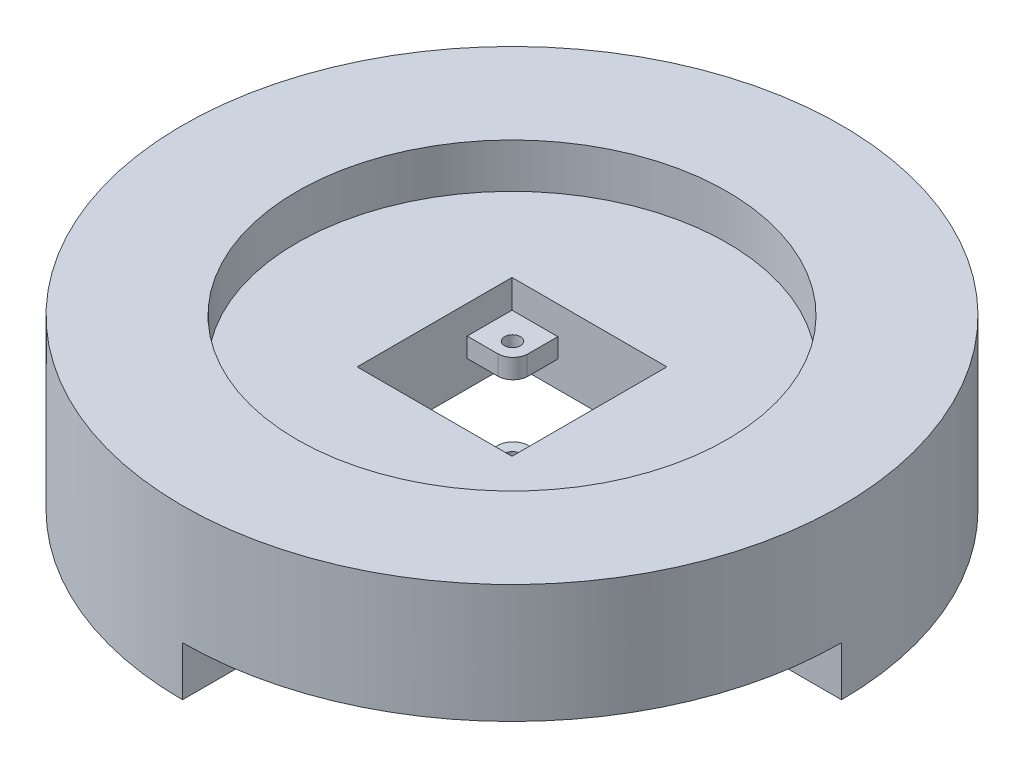
ISO-10303-21;
HEADER;
FILE_DESCRIPTION(('STEP AP214'),'2;1');
FILE_NAME('part.step','',(''),(''),'','','');
FILE_SCHEMA(('AUTOMOTIVE_DESIGN { 1 0 10303 214 1 1 1 1 }'));
ENDSEC;
DATA;
#1=APPLICATION_CONTEXT('core data for automotive mechanical design processes');
#2=APPLICATION_PROTOCOL_DEFINITION('international standard','automotive_design',2000,#1);
#3=PRODUCT_CONTEXT('',#1,'mechanical');
#4=PRODUCT('Part','Part','',(#3));
#5=PRODUCT_RELATED_PRODUCT_CATEGORY('part','',(#4));
#6=PRODUCT_DEFINITION_FORMATION('','',#4);
#7=PRODUCT_DEFINITION_CONTEXT('part definition',#1,'design');
#8=PRODUCT_DEFINITION('design','',#6,#7);
#9=PRODUCT_DEFINITION_SHAPE('','',#8);
#10=(LENGTH_UNIT() NAMED_UNIT(*) SI_UNIT(.MILLI.,.METRE.));
#11=(NAMED_UNIT(*) PLANE_ANGLE_UNIT() SI_UNIT($,.RADIAN.));
#12=(NAMED_UNIT(*) SI_UNIT($,.STERADIAN.) SOLID_ANGLE_UNIT());
#13=UNCERTAINTY_MEASURE_WITH_UNIT(LENGTH_MEASURE(1.E-05),#10,'distance_accuracy_value','');
#14=(GEOMETRIC_REPRESENTATION_CONTEXT(3) GLOBAL_UNCERTAINTY_ASSIGNED_CONTEXT((#13)) GLOBAL_UNIT_ASSIGNED_CONTEXT((#10,
#11,#12)) REPRESENTATION_CONTEXT('',''));
#15=CARTESIAN_POINT('',(0.,0.,0.));
#16=DIRECTION('',(0.,0.,1.));
#17=DIRECTION('',(1.,0.,0.));
#18=AXIS2_PLACEMENT_3D('',#15,#16,#17);
#19=CARTESIAN_POINT('',(0.,7.,0.));
#20=DIRECTION('',(0.,-1.,0.));
#21=DIRECTION('',(0.,0.,-1.));
#22=AXIS2_PLACEMENT_3D('',#19,#20,#21);
#23=PLANE('',#22);
#24=DIRECTION('',(0.,0.,1.));
#25=VECTOR('',#24,1.);
#26=CARTESIAN_POINT('',(-11.75,7.,-11.75));
#27=LINE('',#26,#25);
#28=CARTESIAN_POINT('',(-11.75,7.,-11.75));
#29=VERTEX_POINT('',#28);
#30=CARTESIAN_POINT('',(-11.75,7.,11.75));
#31=VERTEX_POINT('',#30);
#32=EDGE_CURVE('E258',#29,#31,#27,.T.);
#33=ORIENTED_EDGE('',*,*,#32,.T.);
#34=DIRECTION('',(1.,0.,0.));
#35=VECTOR('',#34,1.);
#36=CARTESIAN_POINT('',(11.75,7.,11.75));
#37=LINE('',#36,#35);
#38=CARTESIAN_POINT('',(11.75,7.,11.75));
#39=VERTEX_POINT('',#38);
#40=EDGE_CURVE('E11',#31,#39,#37,.T.);
#41=ORIENTED_EDGE('',*,*,#40,.T.);
#42=DIRECTION('',(0.,0.,-1.));
#43=VECTOR('',#42,1.);
#44=CARTESIAN_POINT('',(11.75,7.,-11.75));
#45=LINE('',#44,#43);
#46=CARTESIAN_POINT('',(11.75,7.,-11.75));
#47=VERTEX_POINT('',#46);
#48=EDGE_CURVE('E253',#39,#47,#45,.T.);
#49=ORIENTED_EDGE('',*,*,#48,.T.);
#50=DIRECTION('',(-1.,0.,0.));
#51=VECTOR('',#50,1.);
#52=CARTESIAN_POINT('',(11.75,7.,-11.75));
#53=LINE('',#52,#51);
#54=EDGE_CURVE('E256',#47,#29,#53,.T.);
#55=ORIENTED_EDGE('',*,*,#54,.T.);
#56=EDGE_LOOP('',(#33,#41,#49,#55));
#57=FACE_BOUND('',#56,.T.);
#58=CARTESIAN_POINT('',(0.,7.,0.));
#59=DIRECTION('',(0.,-1.,0.));
#60=DIRECTION('',(0.,0.,-1.));
#61=AXIS2_PLACEMENT_3D('',#58,#59,#60);
#62=CIRCLE('',#61,50.);
#63=CARTESIAN_POINT('',(-50.,7.,0.));
#64=VERTEX_POINT('',#63);
#65=CARTESIAN_POINT('',(0.,7.,-50.));
#66=VERTEX_POINT('',#65);
#67=EDGE_CURVE('E251',#64,#66,#62,.T.);
#68=ORIENTED_EDGE('',*,*,#67,.T.);
#69=DIRECTION('',(0.,0.,-1.));
#70=VECTOR('',#69,1.);
#71=CARTESIAN_POINT('',(0.,7.,-40.));
#72=LINE('',#71,#70);
#73=CARTESIAN_POINT('',(0.,7.,-40.));
#74=VERTEX_POINT('',#73);
#75=EDGE_CURVE('E195',#74,#66,#72,.T.);
#76=ORIENTED_EDGE('',*,*,#75,.F.);
#77=CARTESIAN_POINT('',(0.,7.,0.));
#78=DIRECTION('',(0.,1.,0.));
#79=DIRECTION('',(0.,0.,-1.));
#80=AXIS2_PLACEMENT_3D('',#77,#78,#79);
#81=CIRCLE('',#80,40.);
#82=CARTESIAN_POINT('',(40.,7.,0.));
#83=VERTEX_POINT('',#82);
#84=EDGE_CURVE('E202',#83,#74,#81,.T.);
#85=ORIENTED_EDGE('',*,*,#84,.F.);
#86=DIRECTION('',(-1.,0.,0.));
#87=VECTOR('',#86,1.);
#88=CARTESIAN_POINT('',(40.,7.,0.));
#89=LINE('',#88,#87);
#90=CARTESIAN_POINT('',(50.,7.,0.));
#91=VERTEX_POINT('',#90);
#92=EDGE_CURVE('E188',#91,#83,#89,.T.);
#93=ORIENTED_EDGE('',*,*,#92,.F.);
#94=CARTESIAN_POINT('',(0.,7.,50.));
#95=VERTEX_POINT('',#94);
#96=EDGE_CURVE('E254',#91,#95,#62,.T.);
#97=ORIENTED_EDGE('',*,*,#96,.T.);
#98=DIRECTION('',(0.,0.,1.));
#99=VECTOR('',#98,1.);
#100=CARTESIAN_POINT('',(0.,7.,50.));
#101=LINE('',#100,#99);
#102=CARTESIAN_POINT('',(0.,7.,40.));
#103=VERTEX_POINT('',#102);
#104=EDGE_CURVE('E64',#103,#95,#101,.T.);
#105=ORIENTED_EDGE('',*,*,#104,.F.);
#106=CARTESIAN_POINT('',(0.,7.,0.));
#107=DIRECTION('',(0.,1.,0.));
#108=DIRECTION('',(0.,0.,-1.));
#109=AXIS2_PLACEMENT_3D('',#106,#107,#108);
#110=CIRCLE('',#109,40.);
#111=CARTESIAN_POINT('',(-40.,7.,0.));
#112=VERTEX_POINT('',#111);
#113=EDGE_CURVE('E211',#112,#103,#110,.T.);
#114=ORIENTED_EDGE('',*,*,#113,.F.);
#115=DIRECTION('',(1.,0.,0.));
#116=VECTOR('',#115,1.);
#117=CARTESIAN_POINT('',(-50.,7.,0.));
#118=LINE('',#117,#116);
#119=EDGE_CURVE('E208',#64,#112,#118,.T.);
#120=ORIENTED_EDGE('',*,*,#119,.F.);
#121=EDGE_LOOP('',(#68,#76,#85,#93,#97,#105,#114,#120));
#122=FACE_BOUND('',#121,.T.);
#123=ADVANCED_FACE('F39',(#57,#122),#23,.T.);
#124=CARTESIAN_POINT('',(0.,25.,0.));
#125=DIRECTION('',(0.,-1.,0.));
#126=DIRECTION('',(0.,0.,-1.));
#127=AXIS2_PLACEMENT_3D('',#124,#125,#126);
#128=CYLINDRICAL_SURFACE('',#127,50.);
#129=CARTESIAN_POINT('',(0.,25.,0.));
#130=DIRECTION('',(0.,1.,0.));
#131=DIRECTION('',(0.,0.,1.));
#132=AXIS2_PLACEMENT_3D('',#129,#130,#131);
#133=CIRCLE('',#132,50.);
#134=CARTESIAN_POINT('',(0.,25.,50.));
#135=VERTEX_POINT('',#134);
#136=EDGE_CURVE('E352',#135,#135,#133,.T.);
#137=ORIENTED_EDGE('',*,*,#136,.F.);
#138=EDGE_LOOP('',(#137));
#139=FACE_BOUND('',#138,.T.);
#140=ORIENTED_EDGE('',*,*,#67,.F.);
#141=DIRECTION('',(0.,1.,0.));
#142=VECTOR('',#141,1.);
#143=CARTESIAN_POINT('',(-50.,-0.5,0.));
#144=LINE('',#143,#142);
#145=CARTESIAN_POINT('',(-50.,-0.5,0.));
#146=VERTEX_POINT('',#145);
#147=EDGE_CURVE('E241',#146,#64,#144,.T.);
#148=ORIENTED_EDGE('',*,*,#147,.F.);
#149=CARTESIAN_POINT('',(0.,-0.5,0.));
#150=DIRECTION('',(0.,-1.,0.));
#151=DIRECTION('',(0.,0.,-1.));
#152=AXIS2_PLACEMENT_3D('',#149,#150,#151);
#153=CIRCLE('',#152,50.);
#154=CARTESIAN_POINT('',(0.,-0.5,50.));
#155=VERTEX_POINT('',#154);
#156=EDGE_CURVE('E221',#155,#146,#153,.T.);
#157=ORIENTED_EDGE('',*,*,#156,.F.);
#158=DIRECTION('',(0.,1.,0.));
#159=VECTOR('',#158,1.);
#160=CARTESIAN_POINT('',(0.,-0.5,50.));
#161=LINE('',#160,#159);
#162=EDGE_CURVE('E229',#155,#95,#161,.T.);
#163=ORIENTED_EDGE('',*,*,#162,.T.);
#164=ORIENTED_EDGE('',*,*,#96,.F.);
#165=DIRECTION('',(0.,1.,0.));
#166=VECTOR('',#165,1.);
#167=CARTESIAN_POINT('',(50.,-0.5,0.));
#168=LINE('',#167,#166);
#169=CARTESIAN_POINT('',(50.,-0.5,0.));
#170=VERTEX_POINT('',#169);
#171=EDGE_CURVE('E56',#170,#91,#168,.T.);
#172=ORIENTED_EDGE('',*,*,#171,.F.);
#173=CARTESIAN_POINT('',(0.,-0.5,0.));
#174=DIRECTION('',(0.,-1.,0.));
#175=DIRECTION('',(0.,0.,-1.));
#176=AXIS2_PLACEMENT_3D('',#173,#174,#175);
#177=CIRCLE('',#176,50.);
#178=CARTESIAN_POINT('',(0.,-0.5,-50.));
#179=VERTEX_POINT('',#178);
#180=EDGE_CURVE('E216',#179,#170,#177,.T.);
#181=ORIENTED_EDGE('',*,*,#180,.F.);
#182=DIRECTION('',(0.,1.,0.));
#183=VECTOR('',#182,1.);
#184=CARTESIAN_POINT('',(0.,-0.5,-50.));
#185=LINE('',#184,#183);
#186=EDGE_CURVE('E622',#179,#66,#185,.T.);
#187=ORIENTED_EDGE('',*,*,#186,.T.);
#188=EDGE_LOOP('',(#140,#148,#157,#163,#164,#172,#181,#187));
#189=FACE_BOUND('',#188,.T.);
#190=ADVANCED_FACE('F41',(#139,#189),#128,.T.);
#191=CARTESIAN_POINT('',(-11.75,13.95,-11.75));
#192=DIRECTION('',(-1.,0.,0.));
#193=DIRECTION('',(0.,0.,1.));
#194=AXIS2_PLACEMENT_3D('',#191,#192,#193);
#195=PLANE('',#194);
#196=ORIENTED_EDGE('',*,*,#32,.F.);
#197=DIRECTION('',(0.,-1.,0.));
#198=VECTOR('',#197,1.);
#199=CARTESIAN_POINT('',(-11.75,11.,-11.75));
#200=LINE('',#199,#198);
#201=CARTESIAN_POINT('',(-11.75,11.,-11.75));
#202=VERTEX_POINT('',#201);
#203=EDGE_CURVE('E268',#202,#29,#200,.T.);
#204=ORIENTED_EDGE('',*,*,#203,.F.);
#205=DIRECTION('',(0.,0.,-1.));
#206=VECTOR('',#205,1.);
#207=CARTESIAN_POINT('',(-11.75,11.,11.75));
#208=LINE('',#207,#206);
#209=CARTESIAN_POINT('',(-11.75,11.,-4.95));
#210=VERTEX_POINT('',#209);
#211=EDGE_CURVE('E260',#210,#202,#208,.T.);
#212=ORIENTED_EDGE('',*,*,#211,.F.);
#213=DIRECTION('',(0.,1.,0.));
#214=VECTOR('',#213,1.);
#215=CARTESIAN_POINT('',(-11.75,-33.2340187157677,-4.95));
#216=LINE('',#215,#214);
#217=CARTESIAN_POINT('',(-11.75,13.95,-4.95));
#218=VERTEX_POINT('',#217);
#219=EDGE_CURVE('E303',#210,#218,#216,.T.);
#220=ORIENTED_EDGE('',*,*,#219,.T.);
#221=DIRECTION('',(0.,0.,1.));
#222=VECTOR('',#221,1.);
#223=CARTESIAN_POINT('',(-11.75,13.95,-11.75));
#224=LINE('',#223,#222);
#225=CARTESIAN_POINT('',(-11.75,13.95,-11.75));
#226=VERTEX_POINT('',#225);
#227=EDGE_CURVE('E319',#226,#218,#224,.T.);
#228=ORIENTED_EDGE('',*,*,#227,.F.);
#229=DIRECTION('',(0.,1.,0.));
#230=VECTOR('',#229,1.);
#231=CARTESIAN_POINT('',(-11.75,13.95,-11.75));
#232=LINE('',#231,#230);
#233=CARTESIAN_POINT('',(-11.75,18.25,-11.75));
#234=VERTEX_POINT('',#233);
#235=EDGE_CURVE('E341',#226,#234,#232,.T.);
#236=ORIENTED_EDGE('',*,*,#235,.T.);
#237=DIRECTION('',(0.,0.,1.));
#238=VECTOR('',#237,1.);
#239=CARTESIAN_POINT('',(-11.75,18.25,-11.75));
#240=LINE('',#239,#238);
#241=CARTESIAN_POINT('',(-11.75,18.25,11.75));
#242=VERTEX_POINT('',#241);
#243=EDGE_CURVE('E305',#234,#242,#240,.T.);
#244=ORIENTED_EDGE('',*,*,#243,.T.);
#245=DIRECTION('',(0.,1.,0.));
#246=VECTOR('',#245,1.);
#247=CARTESIAN_POINT('',(-11.75,13.95,11.75));
#248=LINE('',#247,#246);
#249=EDGE_CURVE('E330',#31,#242,#248,.T.);
#250=ORIENTED_EDGE('',*,*,#249,.F.);
#251=EDGE_LOOP('',(#196,#204,#212,#220,#228,#236,#244,#250));
#252=FACE_BOUND('',#251,.T.);
#253=ADVANCED_FACE('F397',(#252),#195,.F.);
#254=CARTESIAN_POINT('',(11.75,13.95,-11.75));
#255=DIRECTION('',(0.,0.,-1.));
#256=DIRECTION('',(-1.,0.,0.));
#257=AXIS2_PLACEMENT_3D('',#254,#255,#256);
#258=PLANE('',#257);
#259=ORIENTED_EDGE('',*,*,#54,.F.);
#260=DIRECTION('',(0.,1.,0.));
#261=VECTOR('',#260,1.);
#262=CARTESIAN_POINT('',(11.75,13.95,-11.75));
#263=LINE('',#262,#261);
#264=CARTESIAN_POINT('',(11.75,18.25,-11.75));
#265=VERTEX_POINT('',#264);
#266=EDGE_CURVE('E344',#47,#265,#263,.T.);
#267=ORIENTED_EDGE('',*,*,#266,.T.);
#268=DIRECTION('',(-1.,0.,0.));
#269=VECTOR('',#268,1.);
#270=CARTESIAN_POINT('',(11.75,18.25,-11.75));
#271=LINE('',#270,#269);
#272=EDGE_CURVE('E323',#265,#234,#271,.T.);
#273=ORIENTED_EDGE('',*,*,#272,.T.);
#274=ORIENTED_EDGE('',*,*,#235,.F.);
#275=DIRECTION('',(-1.,0.,0.));
#276=VECTOR('',#275,1.);
#277=CARTESIAN_POINT('',(11.75,13.95,-11.75));
#278=LINE('',#277,#276);
#279=CARTESIAN_POINT('',(-4.8,13.95,-11.75));
#280=VERTEX_POINT('',#279);
#281=EDGE_CURVE('E328',#280,#226,#278,.T.);
#282=ORIENTED_EDGE('',*,*,#281,.F.);
#283=DIRECTION('',(0.,1.,0.));
#284=VECTOR('',#283,1.);
#285=CARTESIAN_POINT('',(-4.8,-33.2340187157677,-11.75));
#286=LINE('',#285,#284);
#287=CARTESIAN_POINT('',(-4.8,11.,-11.75));
#288=VERTEX_POINT('',#287);
#289=EDGE_CURVE('E310',#288,#280,#286,.T.);
#290=ORIENTED_EDGE('',*,*,#289,.F.);
#291=DIRECTION('',(1.,0.,0.));
#292=VECTOR('',#291,1.);
#293=CARTESIAN_POINT('',(-11.75,11.,-11.75));
#294=LINE('',#293,#292);
#295=EDGE_CURVE('E262',#202,#288,#294,.T.);
#296=ORIENTED_EDGE('',*,*,#295,.F.);
#297=ORIENTED_EDGE('',*,*,#203,.T.);
#298=EDGE_LOOP('',(#259,#267,#273,#274,#282,#290,#296,#297));
#299=FACE_BOUND('',#298,.T.);
#300=ADVANCED_FACE('F435',(#299),#258,.F.);
#301=CARTESIAN_POINT('',(11.75,13.95,-11.75));
#302=DIRECTION('',(1.,0.,0.));
#303=DIRECTION('',(0.,0.,-1.));
#304=AXIS2_PLACEMENT_3D('',#301,#302,#303);
#305=PLANE('',#304);
#306=ORIENTED_EDGE('',*,*,#48,.F.);
#307=DIRECTION('',(0.,-1.,0.));
#308=VECTOR('',#307,1.);
#309=CARTESIAN_POINT('',(11.75,11.,11.75));
#310=LINE('',#309,#308);
#311=CARTESIAN_POINT('',(11.75,11.,11.75));
#312=VERTEX_POINT('',#311);
#313=EDGE_CURVE('E269',#312,#39,#310,.T.);
#314=ORIENTED_EDGE('',*,*,#313,.F.);
#315=DIRECTION('',(0.,0.,1.));
#316=VECTOR('',#315,1.);
#317=CARTESIAN_POINT('',(11.75,11.,11.75));
#318=LINE('',#317,#316);
#319=CARTESIAN_POINT('',(11.75,11.,4.8));
#320=VERTEX_POINT('',#319);
#321=EDGE_CURVE('E264',#320,#312,#318,.T.);
#322=ORIENTED_EDGE('',*,*,#321,.F.);
#323=DIRECTION('',(0.,1.,0.));
#324=VECTOR('',#323,1.);
#325=CARTESIAN_POINT('',(11.75,-33.2340187157677,4.8));
#326=LINE('',#325,#324);
#327=CARTESIAN_POINT('',(11.75,13.95,4.8));
#328=VERTEX_POINT('',#327);
#329=EDGE_CURVE('E312',#320,#328,#326,.T.);
#330=ORIENTED_EDGE('',*,*,#329,.T.);
#331=DIRECTION('',(0.,0.,-1.));
#332=VECTOR('',#331,1.);
#333=CARTESIAN_POINT('',(11.75,13.95,-11.75));
#334=LINE('',#333,#332);
#335=CARTESIAN_POINT('',(11.75,13.95,11.75));
#336=VERTEX_POINT('',#335);
#337=EDGE_CURVE('E325',#336,#328,#334,.T.);
#338=ORIENTED_EDGE('',*,*,#337,.F.);
#339=DIRECTION('',(0.,1.,0.));
#340=VECTOR('',#339,1.);
#341=CARTESIAN_POINT('',(11.75,13.95,11.75));
#342=LINE('',#341,#340);
#343=CARTESIAN_POINT('',(11.75,18.25,11.75));
#344=VERTEX_POINT('',#343);
#345=EDGE_CURVE('E346',#336,#344,#342,.T.);
#346=ORIENTED_EDGE('',*,*,#345,.T.);
#347=DIRECTION('',(0.,0.,-1.));
#348=VECTOR('',#347,1.);
#349=CARTESIAN_POINT('',(11.75,18.25,-11.75));
#350=LINE('',#349,#348);
#351=EDGE_CURVE('E336',#344,#265,#350,.T.);
#352=ORIENTED_EDGE('',*,*,#351,.T.);
#353=ORIENTED_EDGE('',*,*,#266,.F.);
#354=EDGE_LOOP('',(#306,#314,#322,#330,#338,#346,#352,#353));
#355=FACE_BOUND('',#354,.T.);
#356=ADVANCED_FACE('F438',(#355),#305,.F.);
#357=CARTESIAN_POINT('',(11.75,13.95,11.75));
#358=DIRECTION('',(0.,0.,1.));
#359=DIRECTION('',(1.,0.,0.));
#360=AXIS2_PLACEMENT_3D('',#357,#358,#359);
#361=PLANE('',#360);
#362=ORIENTED_EDGE('',*,*,#40,.F.);
#363=ORIENTED_EDGE('',*,*,#249,.T.);
#364=DIRECTION('',(1.,0.,0.));
#365=VECTOR('',#364,1.);
#366=CARTESIAN_POINT('',(11.75,18.25,11.75));
#367=LINE('',#366,#365);
#368=EDGE_CURVE('E333',#242,#344,#367,.T.);
#369=ORIENTED_EDGE('',*,*,#368,.T.);
#370=ORIENTED_EDGE('',*,*,#345,.F.);
#371=DIRECTION('',(1.,0.,0.));
#372=VECTOR('',#371,1.);
#373=CARTESIAN_POINT('',(11.75,13.95,11.75));
#374=LINE('',#373,#372);
#375=CARTESIAN_POINT('',(4.95,13.95,11.75));
#376=VERTEX_POINT('',#375);
#377=EDGE_CURVE('E322',#376,#336,#374,.T.);
#378=ORIENTED_EDGE('',*,*,#377,.F.);
#379=DIRECTION('',(0.,1.,0.));
#380=VECTOR('',#379,1.);
#381=CARTESIAN_POINT('',(4.95,-33.2340187157677,11.75));
#382=LINE('',#381,#380);
#383=CARTESIAN_POINT('',(4.95,11.,11.75));
#384=VERTEX_POINT('',#383);
#385=EDGE_CURVE('E302',#384,#376,#382,.T.);
#386=ORIENTED_EDGE('',*,*,#385,.F.);
#387=DIRECTION('',(-1.,0.,0.));
#388=VECTOR('',#387,1.);
#389=CARTESIAN_POINT('',(-11.75,11.,11.75));
#390=LINE('',#389,#388);
#391=EDGE_CURVE('E266',#312,#384,#390,.T.);
#392=ORIENTED_EDGE('',*,*,#391,.F.);
#393=ORIENTED_EDGE('',*,*,#313,.T.);
#394=EDGE_LOOP('',(#362,#363,#369,#370,#378,#386,#392,#393));
#395=FACE_BOUND('',#394,.T.);
#396=ADVANCED_FACE('F409',(#395),#361,.F.);
#397=CARTESIAN_POINT('',(-11.75,-33.2340187157677,-4.95));
#398=DIRECTION('',(0.,0.,-1.));
#399=DIRECTION('',(-1.,0.,0.));
#400=AXIS2_PLACEMENT_3D('',#397,#398,#399);
#401=PLANE('',#400);
#402=DIRECTION('',(-1.,0.,0.));
#403=VECTOR('',#402,1.);
#404=CARTESIAN_POINT('',(-11.75,11.,-4.95));
#405=LINE('',#404,#403);
#406=CARTESIAN_POINT('',(-7.1,11.,-4.95));
#407=VERTEX_POINT('',#406);
#408=EDGE_CURVE('E282',#407,#210,#405,.T.);
#409=ORIENTED_EDGE('',*,*,#408,.F.);
#410=DIRECTION('',(0.,1.,0.));
#411=VECTOR('',#410,1.);
#412=CARTESIAN_POINT('',(-7.1,-33.2340187157677,-4.95));
#413=LINE('',#412,#411);
#414=CARTESIAN_POINT('',(-7.1,13.95,-4.95));
#415=VERTEX_POINT('',#414);
#416=EDGE_CURVE('E306',#407,#415,#413,.T.);
#417=ORIENTED_EDGE('',*,*,#416,.T.);
#418=DIRECTION('',(-1.,0.,0.));
#419=VECTOR('',#418,1.);
#420=CARTESIAN_POINT('',(-11.75,13.95,-4.95));
#421=LINE('',#420,#419);
#422=EDGE_CURVE('E299',#415,#218,#421,.T.);
#423=ORIENTED_EDGE('',*,*,#422,.T.);
#424=ORIENTED_EDGE('',*,*,#219,.F.);
#425=EDGE_LOOP('',(#409,#417,#423,#424));
#426=FACE_BOUND('',#425,.T.);
#427=ADVANCED_FACE('F405',(#426),#401,.F.);
#428=CARTESIAN_POINT('',(-7.1,-33.2340187157677,-7.25523255813953));
#429=DIRECTION('',(0.,1.,0.));
#430=DIRECTION('',(0.,0.,1.));
#431=AXIS2_PLACEMENT_3D('',#428,#429,#430);
#432=CYLINDRICAL_SURFACE('',#431,2.30523255813953);
#433=CARTESIAN_POINT('',(-7.1,11.,-7.25523255813953));
#434=DIRECTION('',(0.,-1.,0.));
#435=DIRECTION('',(0.,0.,-1.));
#436=AXIS2_PLACEMENT_3D('',#433,#434,#435);
#437=CIRCLE('',#436,2.30523255813953);
#438=CARTESIAN_POINT('',(-4.8,11.,-7.1));
#439=VERTEX_POINT('',#438);
#440=EDGE_CURVE('E280',#439,#407,#437,.T.);
#441=ORIENTED_EDGE('',*,*,#440,.F.);
#442=DIRECTION('',(0.,1.,0.));
#443=VECTOR('',#442,1.);
#444=CARTESIAN_POINT('',(-4.8,-33.2340187157677,-7.1));
#445=LINE('',#444,#443);
#446=CARTESIAN_POINT('',(-4.8,13.95,-7.1));
#447=VERTEX_POINT('',#446);
#448=EDGE_CURVE('E308',#439,#447,#445,.T.);
#449=ORIENTED_EDGE('',*,*,#448,.T.);
#450=CARTESIAN_POINT('',(-7.1,13.95,-7.25523255813953));
#451=DIRECTION('',(0.,-1.,0.));
#452=DIRECTION('',(0.,0.,-1.));
#453=AXIS2_PLACEMENT_3D('',#450,#451,#452);
#454=CIRCLE('',#453,2.30523255813953);
#455=EDGE_CURVE('E296',#447,#415,#454,.T.);
#456=ORIENTED_EDGE('',*,*,#455,.T.);
#457=ORIENTED_EDGE('',*,*,#416,.F.);
#458=EDGE_LOOP('',(#441,#449,#456,#457));
#459=FACE_BOUND('',#458,.T.);
#460=ADVANCED_FACE('F408',(#459),#432,.T.);
#461=CARTESIAN_POINT('',(-4.8,-33.2340187157677,-7.1));
#462=DIRECTION('',(-1.,0.,0.));
#463=DIRECTION('',(0.,0.,1.));
#464=AXIS2_PLACEMENT_3D('',#461,#462,#463);
#465=PLANE('',#464);
#466=DIRECTION('',(0.,0.,1.));
#467=VECTOR('',#466,1.);
#468=CARTESIAN_POINT('',(-4.8,11.,-7.1));
#469=LINE('',#468,#467);
#470=EDGE_CURVE('E278',#288,#439,#469,.T.);
#471=ORIENTED_EDGE('',*,*,#470,.F.);
#472=ORIENTED_EDGE('',*,*,#289,.T.);
#473=DIRECTION('',(0.,0.,1.));
#474=VECTOR('',#473,1.);
#475=CARTESIAN_POINT('',(-4.8,13.95,-7.1));
#476=LINE('',#475,#474);
#477=EDGE_CURVE('E293',#280,#447,#476,.T.);
#478=ORIENTED_EDGE('',*,*,#477,.T.);
#479=ORIENTED_EDGE('',*,*,#448,.F.);
#480=EDGE_LOOP('',(#471,#472,#478,#479));
#481=FACE_BOUND('',#480,.T.);
#482=ADVANCED_FACE('F413',(#481),#465,.F.);
#483=CARTESIAN_POINT('',(7.09999999999999,-33.2340187157677,4.8));
#484=DIRECTION('',(0.,0.,1.));
#485=DIRECTION('',(1.,0.,0.));
#486=AXIS2_PLACEMENT_3D('',#483,#484,#485);
#487=PLANE('',#486);
#488=DIRECTION('',(1.,0.,0.));
#489=VECTOR('',#488,1.);
#490=CARTESIAN_POINT('',(7.09999999999999,11.,4.8));
#491=LINE('',#490,#489);
#492=CARTESIAN_POINT('',(7.09999999999999,11.,4.8));
#493=VERTEX_POINT('',#492);
#494=EDGE_CURVE('E276',#493,#320,#491,.T.);
#495=ORIENTED_EDGE('',*,*,#494,.F.);
#496=DIRECTION('',(0.,1.,0.));
#497=VECTOR('',#496,1.);
#498=CARTESIAN_POINT('',(7.09999999999999,-33.2340187157677,4.8));
#499=LINE('',#498,#497);
#500=CARTESIAN_POINT('',(7.09999999999999,13.95,4.8));
#501=VERTEX_POINT('',#500);
#502=EDGE_CURVE('E314',#493,#501,#499,.T.);
#503=ORIENTED_EDGE('',*,*,#502,.T.);
#504=DIRECTION('',(1.,0.,0.));
#505=VECTOR('',#504,1.);
#506=CARTESIAN_POINT('',(7.09999999999999,13.95,4.8));
#507=LINE('',#506,#505);
#508=EDGE_CURVE('E290',#501,#328,#507,.T.);
#509=ORIENTED_EDGE('',*,*,#508,.T.);
#510=ORIENTED_EDGE('',*,*,#329,.F.);
#511=EDGE_LOOP('',(#495,#503,#509,#510));
#512=FACE_BOUND('',#511,.T.);
#513=ADVANCED_FACE('F417',(#512),#487,.F.);
#514=CARTESIAN_POINT('',(7.25523255813953,-33.2340187157677,7.1));
#515=DIRECTION('',(0.,1.,0.));
#516=DIRECTION('',(0.,0.,1.));
#517=AXIS2_PLACEMENT_3D('',#514,#515,#516);
#518=CYLINDRICAL_SURFACE('',#517,2.30523255813954);
#519=CARTESIAN_POINT('',(7.25523255813953,11.,7.1));
#520=DIRECTION('',(0.,-1.,0.));
#521=DIRECTION('',(0.,0.,-1.));
#522=AXIS2_PLACEMENT_3D('',#519,#520,#521);
#523=CIRCLE('',#522,2.30523255813954);
#524=CARTESIAN_POINT('',(4.94999999999999,11.,7.1));
#525=VERTEX_POINT('',#524);
#526=EDGE_CURVE('E272',#525,#493,#523,.T.);
#527=ORIENTED_EDGE('',*,*,#526,.F.);
#528=DIRECTION('',(0.,1.,0.));
#529=VECTOR('',#528,1.);
#530=CARTESIAN_POINT('',(4.94999999999999,-33.2340187157677,7.1));
#531=LINE('',#530,#529);
#532=CARTESIAN_POINT('',(4.94999999999999,13.95,7.1));
#533=VERTEX_POINT('',#532);
#534=EDGE_CURVE('E316',#525,#533,#531,.T.);
#535=ORIENTED_EDGE('',*,*,#534,.T.);
#536=CARTESIAN_POINT('',(7.25523255813953,13.95,7.1));
#537=DIRECTION('',(0.,-1.,0.));
#538=DIRECTION('',(0.,0.,1.));
#539=AXIS2_PLACEMENT_3D('',#536,#537,#538);
#540=CIRCLE('',#539,2.30523255813954);
#541=EDGE_CURVE('E287',#533,#501,#540,.T.);
#542=ORIENTED_EDGE('',*,*,#541,.T.);
#543=ORIENTED_EDGE('',*,*,#502,.F.);
#544=EDGE_LOOP('',(#527,#535,#542,#543));
#545=FACE_BOUND('',#544,.T.);
#546=ADVANCED_FACE('F421',(#545),#518,.T.);
#547=CARTESIAN_POINT('',(4.95,-33.2340187157677,11.75));
#548=DIRECTION('',(1.,0.,0.));
#549=DIRECTION('',(0.,0.,-1.));
#550=AXIS2_PLACEMENT_3D('',#547,#548,#549);
#551=PLANE('',#550);
#552=DIRECTION('',(0.,0.,-1.));
#553=VECTOR('',#552,1.);
#554=CARTESIAN_POINT('',(4.95,11.,11.75));
#555=LINE('',#554,#553);
#556=EDGE_CURVE('E48',#384,#525,#555,.T.);
#557=ORIENTED_EDGE('',*,*,#556,.F.);
#558=ORIENTED_EDGE('',*,*,#385,.T.);
#559=DIRECTION('',(0.,0.,-1.));
#560=VECTOR('',#559,1.);
#561=CARTESIAN_POINT('',(4.95,13.95,11.75));
#562=LINE('',#561,#560);
#563=EDGE_CURVE('E284',#376,#533,#562,.T.);
#564=ORIENTED_EDGE('',*,*,#563,.T.);
#565=ORIENTED_EDGE('',*,*,#534,.F.);
#566=EDGE_LOOP('',(#557,#558,#564,#565));
#567=FACE_BOUND('',#566,.T.);
#568=ADVANCED_FACE('F425',(#567),#551,.F.);
#569=CARTESIAN_POINT('',(0.,13.95,0.));
#570=DIRECTION('',(0.,-1.,0.));
#571=DIRECTION('',(0.,0.,-1.));
#572=AXIS2_PLACEMENT_3D('',#569,#570,#571);
#573=PLANE('',#572);
#574=CARTESIAN_POINT('',(7.71360389693213,13.95,7.63860389693208));
#575=DIRECTION('',(0.,1.,0.));
#576=DIRECTION('',(0.,0.,1.));
#577=AXIS2_PLACEMENT_3D('',#574,#575,#576);
#578=CIRCLE('',#577,1.2);
#579=CARTESIAN_POINT('',(7.71360389693213,13.95,8.83860389693208));
#580=VERTEX_POINT('',#579);
#581=EDGE_CURVE('E244',#580,#580,#578,.T.);
#582=ORIENTED_EDGE('',*,*,#581,.F.);
#583=EDGE_LOOP('',(#582));
#584=FACE_BOUND('',#583,.T.);
#585=ORIENTED_EDGE('',*,*,#563,.F.);
#586=ORIENTED_EDGE('',*,*,#377,.T.);
#587=ORIENTED_EDGE('',*,*,#337,.T.);
#588=ORIENTED_EDGE('',*,*,#508,.F.);
#589=ORIENTED_EDGE('',*,*,#541,.F.);
#590=EDGE_LOOP('',(#585,#586,#587,#588,#589));
#591=FACE_BOUND('',#590,.T.);
#592=ADVANCED_FACE('F429',(#584,#591),#573,.F.);
#593=CARTESIAN_POINT('',(-7.63860389693209,13.95,-7.71360389693213));
#594=DIRECTION('',(0.,1.,0.));
#595=DIRECTION('',(0.,0.,1.));
#596=AXIS2_PLACEMENT_3D('',#593,#594,#595);
#597=CIRCLE('',#596,1.2);
#598=CARTESIAN_POINT('',(-7.63860389693209,13.95,-6.51360389693213));
#599=VERTEX_POINT('',#598);
#600=EDGE_CURVE('E245',#599,#599,#597,.T.);
#601=ORIENTED_EDGE('',*,*,#600,.F.);
#602=EDGE_LOOP('',(#601));
#603=FACE_BOUND('',#602,.T.);
#604=ORIENTED_EDGE('',*,*,#477,.F.);
#605=ORIENTED_EDGE('',*,*,#281,.T.);
#606=ORIENTED_EDGE('',*,*,#227,.T.);
#607=ORIENTED_EDGE('',*,*,#422,.F.);
#608=ORIENTED_EDGE('',*,*,#455,.F.);
#609=EDGE_LOOP('',(#604,#605,#606,#607,#608));
#610=FACE_BOUND('',#609,.T.);
#611=ADVANCED_FACE('F433',(#603,#610),#573,.F.);
#612=CARTESIAN_POINT('',(0.,25.,0.));
#613=DIRECTION('',(0.,1.,0.));
#614=DIRECTION('',(0.,0.,1.));
#615=AXIS2_PLACEMENT_3D('',#612,#613,#614);
#616=PLANE('',#615);
#617=CARTESIAN_POINT('',(0.,25.,0.));
#618=DIRECTION('',(0.,1.,0.));
#619=DIRECTION('',(0.,0.,1.));
#620=AXIS2_PLACEMENT_3D('',#617,#618,#619);
#621=CIRCLE('',#620,32.625);
#622=CARTESIAN_POINT('',(0.,25.,32.625));
#623=VERTEX_POINT('',#622);
#624=EDGE_CURVE('E343',#623,#623,#621,.T.);
#625=ORIENTED_EDGE('',*,*,#624,.F.);
#626=EDGE_LOOP('',(#625));
#627=FACE_BOUND('',#626,.T.);
#628=ORIENTED_EDGE('',*,*,#136,.T.);
#629=EDGE_LOOP('',(#628));
#630=FACE_BOUND('',#629,.T.);
#631=ADVANCED_FACE('F455',(#627,#630),#616,.T.);
#632=CARTESIAN_POINT('',(0.,18.25,0.));
#633=DIRECTION('',(0.,1.,0.));
#634=DIRECTION('',(0.,0.,1.));
#635=AXIS2_PLACEMENT_3D('',#632,#633,#634);
#636=CYLINDRICAL_SURFACE('',#635,32.625);
#637=CARTESIAN_POINT('',(0.,18.25,0.));
#638=DIRECTION('',(0.,1.,0.));
#639=DIRECTION('',(0.,0.,1.));
#640=AXIS2_PLACEMENT_3D('',#637,#638,#639);
#641=CIRCLE('',#640,32.625);
#642=CARTESIAN_POINT('',(0.,18.25,32.625));
#643=VERTEX_POINT('',#642);
#644=EDGE_CURVE('E349',#643,#643,#641,.T.);
#645=ORIENTED_EDGE('',*,*,#644,.F.);
#646=EDGE_LOOP('',(#645));
#647=FACE_BOUND('',#646,.T.);
#648=ORIENTED_EDGE('',*,*,#624,.T.);
#649=EDGE_LOOP('',(#648));
#650=FACE_BOUND('',#649,.T.);
#651=ADVANCED_FACE('F452',(#647,#650),#636,.F.);
#652=CARTESIAN_POINT('',(0.,18.25,0.));
#653=DIRECTION('',(0.,1.,0.));
#654=DIRECTION('',(0.,0.,1.));
#655=AXIS2_PLACEMENT_3D('',#652,#653,#654);
#656=PLANE('',#655);
#657=ORIENTED_EDGE('',*,*,#243,.F.);
#658=ORIENTED_EDGE('',*,*,#272,.F.);
#659=ORIENTED_EDGE('',*,*,#351,.F.);
#660=ORIENTED_EDGE('',*,*,#368,.F.);
#661=EDGE_LOOP('',(#657,#658,#659,#660));
#662=FACE_BOUND('',#661,.T.);
#663=ORIENTED_EDGE('',*,*,#644,.T.);
#664=EDGE_LOOP('',(#663));
#665=FACE_BOUND('',#664,.T.);
#666=ADVANCED_FACE('F449',(#662,#665),#656,.T.);
#667=CARTESIAN_POINT('',(0.,11.,0.));
#668=DIRECTION('',(0.,-1.,0.));
#669=DIRECTION('',(0.,0.,-1.));
#670=AXIS2_PLACEMENT_3D('',#667,#668,#669);
#671=PLANE('',#670);
#672=CARTESIAN_POINT('',(7.71360389693213,11.,7.63860389693208));
#673=DIRECTION('',(0.,-1.,0.));
#674=DIRECTION('',(0.,0.,-1.));
#675=AXIS2_PLACEMENT_3D('',#672,#673,#674);
#676=CIRCLE('',#675,1.2);
#677=CARTESIAN_POINT('',(7.71360389693213,11.,6.43860389693208));
#678=VERTEX_POINT('',#677);
#679=EDGE_CURVE('E43',#678,#678,#676,.T.);
#680=ORIENTED_EDGE('',*,*,#679,.F.);
#681=EDGE_LOOP('',(#680));
#682=FACE_BOUND('',#681,.T.);
#683=ORIENTED_EDGE('',*,*,#494,.T.);
#684=ORIENTED_EDGE('',*,*,#321,.T.);
#685=ORIENTED_EDGE('',*,*,#391,.T.);
#686=ORIENTED_EDGE('',*,*,#556,.T.);
#687=ORIENTED_EDGE('',*,*,#526,.T.);
#688=EDGE_LOOP('',(#683,#684,#685,#686,#687));
#689=FACE_BOUND('',#688,.T.);
#690=ADVANCED_FACE('F403',(#682,#689),#671,.T.);
#691=CARTESIAN_POINT('',(-7.63860389693209,11.,-7.71360389693213));
#692=DIRECTION('',(0.,-1.,0.));
#693=DIRECTION('',(0.,0.,-1.));
#694=AXIS2_PLACEMENT_3D('',#691,#692,#693);
#695=CIRCLE('',#694,1.2);
#696=CARTESIAN_POINT('',(-7.63860389693209,11.,-8.91360389693213));
#697=VERTEX_POINT('',#696);
#698=EDGE_CURVE('E248',#697,#697,#695,.T.);
#699=ORIENTED_EDGE('',*,*,#698,.F.);
#700=EDGE_LOOP('',(#699));
#701=FACE_BOUND('',#700,.T.);
#702=ORIENTED_EDGE('',*,*,#408,.T.);
#703=ORIENTED_EDGE('',*,*,#211,.T.);
#704=ORIENTED_EDGE('',*,*,#295,.T.);
#705=ORIENTED_EDGE('',*,*,#470,.T.);
#706=ORIENTED_EDGE('',*,*,#440,.T.);
#707=EDGE_LOOP('',(#702,#703,#704,#705,#706));
#708=FACE_BOUND('',#707,.T.);
#709=ADVANCED_FACE('F400',(#701,#708),#671,.T.);
#710=CARTESIAN_POINT('',(-7.63860389693209,7.,-7.71360389693213));
#711=DIRECTION('',(0.,1.,0.));
#712=DIRECTION('',(0.,0.,1.));
#713=AXIS2_PLACEMENT_3D('',#710,#711,#712);
#714=CYLINDRICAL_SURFACE('',#713,1.2);
#715=ORIENTED_EDGE('',*,*,#698,.T.);
#716=EDGE_LOOP('',(#715));
#717=FACE_BOUND('',#716,.T.);
#718=ORIENTED_EDGE('',*,*,#600,.T.);
#719=EDGE_LOOP('',(#718));
#720=FACE_BOUND('',#719,.T.);
#721=ADVANCED_FACE('F389',(#717,#720),#714,.F.);
#722=CARTESIAN_POINT('',(7.71360389693213,7.,7.63860389693208));
#723=DIRECTION('',(0.,1.,0.));
#724=DIRECTION('',(0.,0.,1.));
#725=AXIS2_PLACEMENT_3D('',#722,#723,#724);
#726=CYLINDRICAL_SURFACE('',#725,1.2);
#727=ORIENTED_EDGE('',*,*,#679,.T.);
#728=EDGE_LOOP('',(#727));
#729=FACE_BOUND('',#728,.T.);
#730=ORIENTED_EDGE('',*,*,#581,.T.);
#731=EDGE_LOOP('',(#730));
#732=FACE_BOUND('',#731,.T.);
#733=ADVANCED_FACE('F381',(#729,#732),#726,.F.);
#734=CARTESIAN_POINT('',(-50.,-0.5,0.));
#735=DIRECTION('',(0.,0.,1.));
#736=DIRECTION('',(1.,0.,0.));
#737=AXIS2_PLACEMENT_3D('',#734,#735,#736);
#738=PLANE('',#737);
#739=ORIENTED_EDGE('',*,*,#119,.T.);
#740=DIRECTION('',(0.,1.,0.));
#741=VECTOR('',#740,1.);
#742=CARTESIAN_POINT('',(-40.,-0.5,0.));
#743=LINE('',#742,#741);
#744=CARTESIAN_POINT('',(-40.,-0.5,0.));
#745=VERTEX_POINT('',#744);
#746=EDGE_CURVE('E238',#745,#112,#743,.T.);
#747=ORIENTED_EDGE('',*,*,#746,.F.);
#748=DIRECTION('',(1.,0.,0.));
#749=VECTOR('',#748,1.);
#750=CARTESIAN_POINT('',(-50.,-0.5,0.));
#751=LINE('',#750,#749);
#752=EDGE_CURVE('E224',#146,#745,#751,.T.);
#753=ORIENTED_EDGE('',*,*,#752,.F.);
#754=ORIENTED_EDGE('',*,*,#147,.T.);
#755=EDGE_LOOP('',(#739,#747,#753,#754));
#756=FACE_BOUND('',#755,.T.);
#757=ADVANCED_FACE('F379',(#756),#738,.F.);
#758=CARTESIAN_POINT('',(0.,-0.5,0.));
#759=DIRECTION('',(0.,1.,0.));
#760=DIRECTION('',(0.,0.,1.));
#761=AXIS2_PLACEMENT_3D('',#758,#759,#760);
#762=CYLINDRICAL_SURFACE('',#761,40.);
#763=ORIENTED_EDGE('',*,*,#113,.T.);
#764=DIRECTION('',(0.,1.,0.));
#765=VECTOR('',#764,1.);
#766=CARTESIAN_POINT('',(0.,-0.5,40.));
#767=LINE('',#766,#765);
#768=CARTESIAN_POINT('',(0.,-0.5,40.));
#769=VERTEX_POINT('',#768);
#770=EDGE_CURVE('E235',#769,#103,#767,.T.);
#771=ORIENTED_EDGE('',*,*,#770,.F.);
#772=CARTESIAN_POINT('',(0.,-0.5,0.));
#773=DIRECTION('',(0.,1.,0.));
#774=DIRECTION('',(0.,0.,-1.));
#775=AXIS2_PLACEMENT_3D('',#772,#773,#774);
#776=CIRCLE('',#775,40.);
#777=EDGE_CURVE('E226',#745,#769,#776,.T.);
#778=ORIENTED_EDGE('',*,*,#777,.F.);
#779=ORIENTED_EDGE('',*,*,#746,.T.);
#780=EDGE_LOOP('',(#763,#771,#778,#779));
#781=FACE_BOUND('',#780,.T.);
#782=ADVANCED_FACE('F377',(#781),#762,.F.);
#783=CARTESIAN_POINT('',(0.,-0.5,50.));
#784=DIRECTION('',(-1.,0.,0.));
#785=DIRECTION('',(0.,0.,1.));
#786=AXIS2_PLACEMENT_3D('',#783,#784,#785);
#787=PLANE('',#786);
#788=ORIENTED_EDGE('',*,*,#104,.T.);
#789=ORIENTED_EDGE('',*,*,#162,.F.);
#790=DIRECTION('',(0.,0.,1.));
#791=VECTOR('',#790,1.);
#792=CARTESIAN_POINT('',(0.,-0.5,50.));
#793=LINE('',#792,#791);
#794=EDGE_CURVE('E228',#769,#155,#793,.T.);
#795=ORIENTED_EDGE('',*,*,#794,.F.);
#796=ORIENTED_EDGE('',*,*,#770,.T.);
#797=EDGE_LOOP('',(#788,#789,#795,#796));
#798=FACE_BOUND('',#797,.T.);
#799=ADVANCED_FACE('F366',(#798),#787,.F.);
#800=CARTESIAN_POINT('',(0.,-0.5,0.));
#801=DIRECTION('',(0.,-1.,0.));
#802=DIRECTION('',(0.,0.,-1.));
#803=AXIS2_PLACEMENT_3D('',#800,#801,#802);
#804=PLANE('',#803);
#805=ORIENTED_EDGE('',*,*,#156,.T.);
#806=ORIENTED_EDGE('',*,*,#752,.T.);
#807=ORIENTED_EDGE('',*,*,#777,.T.);
#808=ORIENTED_EDGE('',*,*,#794,.T.);
#809=EDGE_LOOP('',(#805,#806,#807,#808));
#810=FACE_BOUND('',#809,.T.);
#811=ADVANCED_FACE('F373',(#810),#804,.T.);
#812=CARTESIAN_POINT('',(0.,-0.5,0.));
#813=DIRECTION('',(0.,1.,0.));
#814=DIRECTION('',(0.,0.,1.));
#815=AXIS2_PLACEMENT_3D('',#812,#813,#814);
#816=CYLINDRICAL_SURFACE('',#815,40.);
#817=ORIENTED_EDGE('',*,*,#84,.T.);
#818=DIRECTION('',(0.,1.,0.));
#819=VECTOR('',#818,1.);
#820=CARTESIAN_POINT('',(0.,-0.5,-40.));
#821=LINE('',#820,#819);
#822=CARTESIAN_POINT('',(0.,-0.5,-40.));
#823=VERTEX_POINT('',#822);
#824=EDGE_CURVE('E621',#823,#74,#821,.T.);
#825=ORIENTED_EDGE('',*,*,#824,.F.);
#826=CARTESIAN_POINT('',(0.,-0.5,0.));
#827=DIRECTION('',(0.,1.,0.));
#828=DIRECTION('',(0.,0.,-1.));
#829=AXIS2_PLACEMENT_3D('',#826,#827,#828);
#830=CIRCLE('',#829,40.);
#831=CARTESIAN_POINT('',(40.,-0.5,0.));
#832=VERTEX_POINT('',#831);
#833=EDGE_CURVE('E196',#832,#823,#830,.T.);
#834=ORIENTED_EDGE('',*,*,#833,.F.);
#835=DIRECTION('',(0.,1.,0.));
#836=VECTOR('',#835,1.);
#837=CARTESIAN_POINT('',(40.,-0.5,0.));
#838=LINE('',#837,#836);
#839=EDGE_CURVE('E191',#832,#83,#838,.T.);
#840=ORIENTED_EDGE('',*,*,#839,.T.);
#841=EDGE_LOOP('',(#817,#825,#834,#840));
#842=FACE_BOUND('',#841,.T.);
#843=ADVANCED_FACE('F200',(#842),#816,.F.);
#844=CARTESIAN_POINT('',(0.,-0.5,-40.));
#845=DIRECTION('',(1.,0.,0.));
#846=DIRECTION('',(0.,0.,-1.));
#847=AXIS2_PLACEMENT_3D('',#844,#845,#846);
#848=PLANE('',#847);
#849=ORIENTED_EDGE('',*,*,#75,.T.);
#850=ORIENTED_EDGE('',*,*,#186,.F.);
#851=DIRECTION('',(0.,0.,-1.));
#852=VECTOR('',#851,1.);
#853=CARTESIAN_POINT('',(0.,-0.5,-40.));
#854=LINE('',#853,#852);
#855=EDGE_CURVE('E218',#823,#179,#854,.T.);
#856=ORIENTED_EDGE('',*,*,#855,.F.);
#857=ORIENTED_EDGE('',*,*,#824,.T.);
#858=EDGE_LOOP('',(#849,#850,#856,#857));
#859=FACE_BOUND('',#858,.T.);
#860=ADVANCED_FACE('F590',(#859),#848,.F.);
#861=CARTESIAN_POINT('',(40.,-0.5,0.));
#862=DIRECTION('',(0.,0.,-1.));
#863=DIRECTION('',(-1.,0.,0.));
#864=AXIS2_PLACEMENT_3D('',#861,#862,#863);
#865=PLANE('',#864);
#866=ORIENTED_EDGE('',*,*,#92,.T.);
#867=ORIENTED_EDGE('',*,*,#839,.F.);
#868=DIRECTION('',(-1.,0.,0.));
#869=VECTOR('',#868,1.);
#870=CARTESIAN_POINT('',(40.,-0.5,0.));
#871=LINE('',#870,#869);
#872=EDGE_CURVE('E205',#170,#832,#871,.T.);
#873=ORIENTED_EDGE('',*,*,#872,.F.);
#874=ORIENTED_EDGE('',*,*,#171,.T.);
#875=EDGE_LOOP('',(#866,#867,#873,#874));
#876=FACE_BOUND('',#875,.T.);
#877=ADVANCED_FACE('F190',(#876),#865,.F.);
#878=CARTESIAN_POINT('',(0.,-0.5,0.));
#879=DIRECTION('',(0.,-1.,0.));
#880=DIRECTION('',(0.,0.,-1.));
#881=AXIS2_PLACEMENT_3D('',#878,#879,#880);
#882=PLANE('',#881);
#883=ORIENTED_EDGE('',*,*,#833,.T.);
#884=ORIENTED_EDGE('',*,*,#855,.T.);
#885=ORIENTED_EDGE('',*,*,#180,.T.);
#886=ORIENTED_EDGE('',*,*,#872,.T.);
#887=EDGE_LOOP('',(#883,#884,#885,#886));
#888=FACE_BOUND('',#887,.T.);
#889=ADVANCED_FACE('F608',(#888),#882,.T.);
#890=CLOSED_SHELL('',(#123,#190,#253,#300,#356,#396,#427,#460,#482,#513,#546,#568,#592,#611,
#631,#651,#666,#690,#709,#721,#733,#757,#782,#799,#811,#843,#860,#877,#889));
#891=MANIFOLD_SOLID_BREP('B2',#890);
#892=ADVANCED_BREP_SHAPE_REPRESENTATION('',(#18,#891),#14);
#893=SHAPE_DEFINITION_REPRESENTATION(#9,#892);
ENDSEC;
END-ISO-10303-21;
